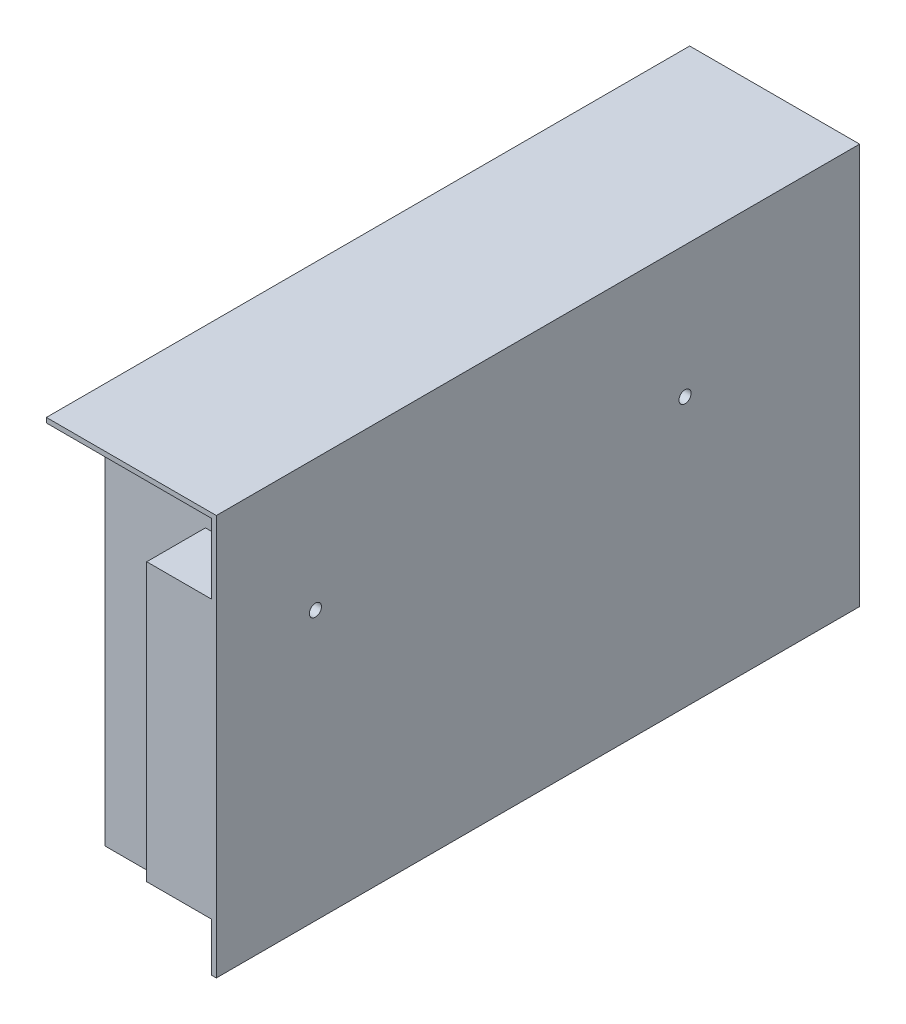
ISO-10303-21;
HEADER;
FILE_DESCRIPTION(('STEP AP214'),'2;1');
FILE_NAME('part.step','',(''),(''),'','','');
FILE_SCHEMA(('AUTOMOTIVE_DESIGN { 1 0 10303 214 1 1 1 1 }'));
ENDSEC;
DATA;
#1=APPLICATION_CONTEXT('core data for automotive mechanical design processes');
#2=APPLICATION_PROTOCOL_DEFINITION('international standard','automotive_design',2000,#1);
#3=PRODUCT_CONTEXT('',#1,'mechanical');
#4=PRODUCT('Part','Part','',(#3));
#5=PRODUCT_RELATED_PRODUCT_CATEGORY('part','',(#4));
#6=PRODUCT_DEFINITION_FORMATION('','',#4);
#7=PRODUCT_DEFINITION_CONTEXT('part definition',#1,'design');
#8=PRODUCT_DEFINITION('design','',#6,#7);
#9=PRODUCT_DEFINITION_SHAPE('','',#8);
#10=(LENGTH_UNIT() NAMED_UNIT(*) SI_UNIT(.MILLI.,.METRE.));
#11=(NAMED_UNIT(*) PLANE_ANGLE_UNIT() SI_UNIT($,.RADIAN.));
#12=(NAMED_UNIT(*) SI_UNIT($,.STERADIAN.) SOLID_ANGLE_UNIT());
#13=UNCERTAINTY_MEASURE_WITH_UNIT(LENGTH_MEASURE(1.E-05),#10,'distance_accuracy_value','');
#14=(GEOMETRIC_REPRESENTATION_CONTEXT(3) GLOBAL_UNCERTAINTY_ASSIGNED_CONTEXT((#13)) GLOBAL_UNIT_ASSIGNED_CONTEXT((#10,
#11,#12)) REPRESENTATION_CONTEXT('',''));
#15=CARTESIAN_POINT('',(0.,0.,0.));
#16=DIRECTION('',(0.,0.,1.));
#17=DIRECTION('',(1.,0.,0.));
#18=AXIS2_PLACEMENT_3D('',#15,#16,#17);
#19=CARTESIAN_POINT('',(40.8,0.,0.));
#20=DIRECTION('',(1.,0.,0.));
#21=DIRECTION('',(0.,0.,-1.));
#22=AXIS2_PLACEMENT_3D('',#19,#20,#21);
#23=PLANE('',#22);
#24=DIRECTION('',(0.,0.,1.));
#25=VECTOR('',#24,1.);
#26=CARTESIAN_POINT('',(40.8,-67.2045,42.3425));
#27=LINE('',#26,#25);
#28=CARTESIAN_POINT('',(40.8,-67.2045,42.3425));
#29=VERTEX_POINT('',#28);
#30=CARTESIAN_POINT('',(40.8,-67.2045,56.8425));
#31=VERTEX_POINT('',#30);
#32=EDGE_CURVE('E225',#29,#31,#27,.T.);
#33=ORIENTED_EDGE('',*,*,#32,.F.);
#34=DIRECTION('',(0.,-1.,0.));
#35=VECTOR('',#34,1.);
#36=CARTESIAN_POINT('',(40.8,18.5955,42.3425));
#37=LINE('',#36,#35);
#38=CARTESIAN_POINT('',(40.8,-79.2045,42.3425));
#39=VERTEX_POINT('',#38);
#40=EDGE_CURVE('E141',#29,#39,#37,.T.);
#41=ORIENTED_EDGE('',*,*,#40,.T.);
#42=DIRECTION('',(0.,0.,1.));
#43=VECTOR('',#42,1.);
#44=CARTESIAN_POINT('',(40.8,-79.2045,42.3425));
#45=LINE('',#44,#43);
#46=CARTESIAN_POINT('',(40.8,-79.2045,56.8425));
#47=VERTEX_POINT('',#46);
#48=EDGE_CURVE('E159',#39,#47,#45,.T.);
#49=ORIENTED_EDGE('',*,*,#48,.T.);
#50=DIRECTION('',(0.,1.,0.));
#51=VECTOR('',#50,1.);
#52=CARTESIAN_POINT('',(40.8,-79.2045,56.8425));
#53=LINE('',#52,#51);
#54=EDGE_CURVE('E154',#47,#31,#53,.T.);
#55=ORIENTED_EDGE('',*,*,#54,.T.);
#56=EDGE_LOOP('',(#33,#41,#49,#55));
#57=FACE_BOUND('',#56,.T.);
#58=ADVANCED_FACE('F35',(#57),#23,.F.);
#59=DIRECTION('',(0.,0.,-1.));
#60=VECTOR('',#59,1.);
#61=CARTESIAN_POINT('',(40.8,1.29549999999999,42.3425));
#62=LINE('',#61,#60);
#63=CARTESIAN_POINT('',(40.8,1.29549999999999,56.8425));
#64=VERTEX_POINT('',#63);
#65=CARTESIAN_POINT('',(40.8,1.29549999999999,42.3425));
#66=VERTEX_POINT('',#65);
#67=EDGE_CURVE('E136',#64,#66,#62,.T.);
#68=ORIENTED_EDGE('',*,*,#67,.F.);
#69=CARTESIAN_POINT('',(40.8,18.5955,56.8425));
#70=VERTEX_POINT('',#69);
#71=EDGE_CURVE('E158',#64,#70,#53,.T.);
#72=ORIENTED_EDGE('',*,*,#71,.T.);
#73=DIRECTION('',(0.,0.,-1.));
#74=VECTOR('',#73,1.);
#75=CARTESIAN_POINT('',(40.8,18.5955,56.8425));
#76=LINE('',#75,#74);
#77=CARTESIAN_POINT('',(40.8,18.5955,42.3425));
#78=VERTEX_POINT('',#77);
#79=EDGE_CURVE('E149',#70,#78,#76,.T.);
#80=ORIENTED_EDGE('',*,*,#79,.T.);
#81=EDGE_CURVE('E162',#78,#66,#37,.T.);
#82=ORIENTED_EDGE('',*,*,#81,.T.);
#83=EDGE_LOOP('',(#68,#72,#80,#82));
#84=FACE_BOUND('',#83,.T.);
#85=ADVANCED_FACE('F232',(#84),#23,.F.);
#86=CARTESIAN_POINT('',(140.869054814942,18.5955,42.3425));
#87=DIRECTION('',(0.,0.,-1.));
#88=DIRECTION('',(0.,1.,0.));
#89=AXIS2_PLACEMENT_3D('',#86,#87,#88);
#90=PLANE('',#89);
#91=DIRECTION('',(1.,0.,0.));
#92=VECTOR('',#91,1.);
#93=CARTESIAN_POINT('',(24.8,-67.2045,42.3425));
#94=LINE('',#93,#92);
#95=CARTESIAN_POINT('',(24.8,-67.2045,42.3425));
#96=VERTEX_POINT('',#95);
#97=EDGE_CURVE('E123',#96,#29,#94,.T.);
#98=ORIENTED_EDGE('',*,*,#97,.F.);
#99=DIRECTION('',(0.,-1.,0.));
#100=VECTOR('',#99,1.);
#101=CARTESIAN_POINT('',(24.8,1.29549999999999,42.3425));
#102=LINE('',#101,#100);
#103=CARTESIAN_POINT('',(24.8,1.29549999999999,42.3425));
#104=VERTEX_POINT('',#103);
#105=EDGE_CURVE('E130',#104,#96,#102,.T.);
#106=ORIENTED_EDGE('',*,*,#105,.F.);
#107=DIRECTION('',(1.,0.,0.));
#108=VECTOR('',#107,1.);
#109=CARTESIAN_POINT('',(24.8,1.29549999999999,42.3425));
#110=LINE('',#109,#108);
#111=EDGE_CURVE('E50',#104,#66,#110,.T.);
#112=ORIENTED_EDGE('',*,*,#111,.T.);
#113=ORIENTED_EDGE('',*,*,#81,.F.);
#114=DIRECTION('',(-1.,0.,0.));
#115=VECTOR('',#114,1.);
#116=CARTESIAN_POINT('',(140.869054814942,18.5955,42.3425));
#117=LINE('',#116,#115);
#118=CARTESIAN_POINT('',(0.,18.5955,42.3425));
#119=VERTEX_POINT('',#118);
#120=EDGE_CURVE('E153',#78,#119,#117,.T.);
#121=ORIENTED_EDGE('',*,*,#120,.T.);
#122=DIRECTION('',(0.,-1.,0.));
#123=VECTOR('',#122,1.);
#124=CARTESIAN_POINT('',(0.,18.5955,42.3425));
#125=LINE('',#124,#123);
#126=CARTESIAN_POINT('',(0.,-79.2045,42.3425));
#127=VERTEX_POINT('',#126);
#128=EDGE_CURVE('E143',#119,#127,#125,.T.);
#129=ORIENTED_EDGE('',*,*,#128,.T.);
#130=DIRECTION('',(-1.,0.,0.));
#131=VECTOR('',#130,1.);
#132=CARTESIAN_POINT('',(140.869054814942,-79.2045,42.3425));
#133=LINE('',#132,#131);
#134=EDGE_CURVE('E161',#39,#127,#133,.T.);
#135=ORIENTED_EDGE('',*,*,#134,.F.);
#136=ORIENTED_EDGE('',*,*,#40,.F.);
#137=EDGE_LOOP('',(#98,#106,#112,#113,#121,#129,#135,#136));
#138=FACE_BOUND('',#137,.T.);
#139=ADVANCED_FACE('F139',(#138),#90,.F.);
#140=CARTESIAN_POINT('',(42.,19.7955,56.8425));
#141=DIRECTION('',(0.,0.,-1.));
#142=DIRECTION('',(0.,1.,0.));
#143=AXIS2_PLACEMENT_3D('',#140,#141,#142);
#144=PLANE('',#143);
#145=DIRECTION('',(-1.,0.,0.));
#146=VECTOR('',#145,1.);
#147=CARTESIAN_POINT('',(140.869054814942,18.5955,56.8425));
#148=LINE('',#147,#146);
#149=CARTESIAN_POINT('',(0.,18.5955,56.8425));
#150=VERTEX_POINT('',#149);
#151=EDGE_CURVE('E157',#70,#150,#148,.T.);
#152=ORIENTED_EDGE('',*,*,#151,.F.);
#153=ORIENTED_EDGE('',*,*,#71,.F.);
#154=DIRECTION('',(1.,0.,0.));
#155=VECTOR('',#154,1.);
#156=CARTESIAN_POINT('',(24.8,1.29549999999999,56.8425));
#157=LINE('',#156,#155);
#158=CARTESIAN_POINT('',(24.8,1.29549999999999,56.8425));
#159=VERTEX_POINT('',#158);
#160=EDGE_CURVE('E145',#159,#64,#157,.T.);
#161=ORIENTED_EDGE('',*,*,#160,.F.);
#162=DIRECTION('',(0.,1.,0.));
#163=VECTOR('',#162,1.);
#164=CARTESIAN_POINT('',(24.8,1.29549999999999,56.8425));
#165=LINE('',#164,#163);
#166=CARTESIAN_POINT('',(24.8,-67.2045,56.8425));
#167=VERTEX_POINT('',#166);
#168=EDGE_CURVE('E129',#167,#159,#165,.T.);
#169=ORIENTED_EDGE('',*,*,#168,.F.);
#170=DIRECTION('',(1.,0.,0.));
#171=VECTOR('',#170,1.);
#172=CARTESIAN_POINT('',(24.8,-67.2045,56.8425));
#173=LINE('',#172,#171);
#174=EDGE_CURVE('E126',#167,#31,#173,.T.);
#175=ORIENTED_EDGE('',*,*,#174,.T.);
#176=ORIENTED_EDGE('',*,*,#54,.F.);
#177=DIRECTION('',(-1.,0.,0.));
#178=VECTOR('',#177,1.);
#179=CARTESIAN_POINT('',(42.,-79.2045,56.8425));
#180=LINE('',#179,#178);
#181=CARTESIAN_POINT('',(42.,-79.2045,56.8425));
#182=VERTEX_POINT('',#181);
#183=EDGE_CURVE('E12',#182,#47,#180,.T.);
#184=ORIENTED_EDGE('',*,*,#183,.F.);
#185=DIRECTION('',(0.,-1.,0.));
#186=VECTOR('',#185,1.);
#187=CARTESIAN_POINT('',(42.,19.7955,56.8425));
#188=LINE('',#187,#186);
#189=CARTESIAN_POINT('',(42.,19.7955,56.8425));
#190=VERTEX_POINT('',#189);
#191=EDGE_CURVE('E170',#190,#182,#188,.T.);
#192=ORIENTED_EDGE('',*,*,#191,.F.);
#193=DIRECTION('',(-1.,0.,0.));
#194=VECTOR('',#193,1.);
#195=CARTESIAN_POINT('',(42.,19.7955,56.8425));
#196=LINE('',#195,#194);
#197=CARTESIAN_POINT('',(0.,19.7955,56.8425));
#198=VERTEX_POINT('',#197);
#199=EDGE_CURVE('E180',#190,#198,#196,.T.);
#200=ORIENTED_EDGE('',*,*,#199,.T.);
#201=DIRECTION('',(0.,-1.,0.));
#202=VECTOR('',#201,1.);
#203=CARTESIAN_POINT('',(0.,19.7955,56.8425));
#204=LINE('',#203,#202);
#205=EDGE_CURVE('E169',#198,#150,#204,.T.);
#206=ORIENTED_EDGE('',*,*,#205,.T.);
#207=EDGE_LOOP('',(#152,#153,#161,#169,#175,#176,#184,#192,#200,#206));
#208=FACE_BOUND('',#207,.T.);
#209=ADVANCED_FACE('F37',(#208),#144,.F.);
#210=CARTESIAN_POINT('',(42.,-79.2045,56.8425));
#211=DIRECTION('',(0.,1.,0.));
#212=DIRECTION('',(0.,0.,1.));
#213=AXIS2_PLACEMENT_3D('',#210,#211,#212);
#214=PLANE('',#213);
#215=ORIENTED_EDGE('',*,*,#183,.T.);
#216=ORIENTED_EDGE('',*,*,#48,.F.);
#217=ORIENTED_EDGE('',*,*,#134,.T.);
#218=DIRECTION('',(0.,0.,-1.));
#219=VECTOR('',#218,1.);
#220=CARTESIAN_POINT('',(0.,-79.2045,56.8425));
#221=LINE('',#220,#219);
#222=CARTESIAN_POINT('',(0.,-79.2045,-102.1575));
#223=VERTEX_POINT('',#222);
#224=EDGE_CURVE('E183',#127,#223,#221,.T.);
#225=ORIENTED_EDGE('',*,*,#224,.T.);
#226=DIRECTION('',(-1.,0.,0.));
#227=VECTOR('',#226,1.);
#228=CARTESIAN_POINT('',(42.,-79.2045,-102.1575));
#229=LINE('',#228,#227);
#230=CARTESIAN_POINT('',(42.,-79.2045,-102.1575));
#231=VERTEX_POINT('',#230);
#232=EDGE_CURVE('E43',#231,#223,#229,.T.);
#233=ORIENTED_EDGE('',*,*,#232,.F.);
#234=DIRECTION('',(0.,0.,-1.));
#235=VECTOR('',#234,1.);
#236=CARTESIAN_POINT('',(42.,-79.2045,56.8425));
#237=LINE('',#236,#235);
#238=EDGE_CURVE('E173',#182,#231,#237,.T.);
#239=ORIENTED_EDGE('',*,*,#238,.F.);
#240=EDGE_LOOP('',(#215,#216,#217,#225,#233,#239));
#241=FACE_BOUND('',#240,.T.);
#242=ADVANCED_FACE('F217',(#241),#214,.F.);
#243=CARTESIAN_POINT('',(42.,19.7955,-102.1575));
#244=DIRECTION('',(0.,0.,1.));
#245=DIRECTION('',(0.,-1.,0.));
#246=AXIS2_PLACEMENT_3D('',#243,#244,#245);
#247=PLANE('',#246);
#248=DIRECTION('',(0.,1.,0.));
#249=VECTOR('',#248,1.);
#250=CARTESIAN_POINT('',(0.,19.7955,-102.1575));
#251=LINE('',#250,#249);
#252=CARTESIAN_POINT('',(0.,19.7955,-102.1575));
#253=VERTEX_POINT('',#252);
#254=EDGE_CURVE('E185',#223,#253,#251,.T.);
#255=ORIENTED_EDGE('',*,*,#254,.T.);
#256=DIRECTION('',(-1.,0.,0.));
#257=VECTOR('',#256,1.);
#258=CARTESIAN_POINT('',(42.,19.7955,-102.1575));
#259=LINE('',#258,#257);
#260=CARTESIAN_POINT('',(42.,19.7955,-102.1575));
#261=VERTEX_POINT('',#260);
#262=EDGE_CURVE('E190',#261,#253,#259,.T.);
#263=ORIENTED_EDGE('',*,*,#262,.F.);
#264=DIRECTION('',(0.,1.,0.));
#265=VECTOR('',#264,1.);
#266=CARTESIAN_POINT('',(42.,19.7955,-102.1575));
#267=LINE('',#266,#265);
#268=EDGE_CURVE('E176',#231,#261,#267,.T.);
#269=ORIENTED_EDGE('',*,*,#268,.F.);
#270=ORIENTED_EDGE('',*,*,#232,.T.);
#271=EDGE_LOOP('',(#255,#263,#269,#270));
#272=FACE_BOUND('',#271,.T.);
#273=ADVANCED_FACE('F197',(#272),#247,.F.);
#274=CARTESIAN_POINT('',(42.,19.7955,56.8425));
#275=DIRECTION('',(0.,-1.,0.));
#276=DIRECTION('',(0.,0.,-1.));
#277=AXIS2_PLACEMENT_3D('',#274,#275,#276);
#278=PLANE('',#277);
#279=DIRECTION('',(0.,0.,1.));
#280=VECTOR('',#279,1.);
#281=CARTESIAN_POINT('',(0.,19.7955,56.8425));
#282=LINE('',#281,#280);
#283=EDGE_CURVE('E174',#253,#198,#282,.T.);
#284=ORIENTED_EDGE('',*,*,#283,.T.);
#285=ORIENTED_EDGE('',*,*,#199,.F.);
#286=DIRECTION('',(0.,0.,1.));
#287=VECTOR('',#286,1.);
#288=CARTESIAN_POINT('',(42.,19.7955,56.8425));
#289=LINE('',#288,#287);
#290=EDGE_CURVE('E178',#261,#190,#289,.T.);
#291=ORIENTED_EDGE('',*,*,#290,.F.);
#292=ORIENTED_EDGE('',*,*,#262,.T.);
#293=EDGE_LOOP('',(#284,#285,#291,#292));
#294=FACE_BOUND('',#293,.T.);
#295=ADVANCED_FACE('F208',(#294),#278,.F.);
#296=CARTESIAN_POINT('',(42.,0.,0.));
#297=DIRECTION('',(1.,0.,0.));
#298=DIRECTION('',(0.,0.,-1.));
#299=AXIS2_PLACEMENT_3D('',#296,#297,#298);
#300=PLANE('',#299);
#301=CARTESIAN_POINT('',(42.,-12.7045,-59.0094801412472));
#302=DIRECTION('',(1.,0.,0.));
#303=DIRECTION('',(0.,0.,-1.));
#304=AXIS2_PLACEMENT_3D('',#301,#302,#303);
#305=CIRCLE('',#304,1.5);
#306=CARTESIAN_POINT('',(42.,-12.7045,-60.5094801412472));
#307=VERTEX_POINT('',#306);
#308=EDGE_CURVE('E291',#307,#307,#305,.T.);
#309=ORIENTED_EDGE('',*,*,#308,.F.);
#310=EDGE_LOOP('',(#309));
#311=FACE_BOUND('',#310,.T.);
#312=CARTESIAN_POINT('',(42.,-12.7045,32.3425));
#313=DIRECTION('',(1.,0.,0.));
#314=DIRECTION('',(0.,0.,-1.));
#315=AXIS2_PLACEMENT_3D('',#312,#313,#314);
#316=CIRCLE('',#315,1.5);
#317=CARTESIAN_POINT('',(42.,-12.7045,30.8425));
#318=VERTEX_POINT('',#317);
#319=EDGE_CURVE('E290',#318,#318,#316,.T.);
#320=ORIENTED_EDGE('',*,*,#319,.F.);
#321=EDGE_LOOP('',(#320));
#322=FACE_BOUND('',#321,.T.);
#323=ORIENTED_EDGE('',*,*,#191,.T.);
#324=ORIENTED_EDGE('',*,*,#238,.T.);
#325=ORIENTED_EDGE('',*,*,#268,.T.);
#326=ORIENTED_EDGE('',*,*,#290,.T.);
#327=EDGE_LOOP('',(#323,#324,#325,#326));
#328=FACE_BOUND('',#327,.T.);
#329=ADVANCED_FACE('F216',(#311,#322,#328),#300,.T.);
#330=CARTESIAN_POINT('',(0.,0.,0.));
#331=DIRECTION('',(1.,0.,0.));
#332=DIRECTION('',(0.,0.,-1.));
#333=AXIS2_PLACEMENT_3D('',#330,#331,#332);
#334=PLANE('',#333);
#335=ORIENTED_EDGE('',*,*,#128,.F.);
#336=DIRECTION('',(0.,0.,-1.));
#337=VECTOR('',#336,1.);
#338=CARTESIAN_POINT('',(0.,18.5955,56.8425));
#339=LINE('',#338,#337);
#340=EDGE_CURVE('E58',#150,#119,#339,.T.);
#341=ORIENTED_EDGE('',*,*,#340,.F.);
#342=ORIENTED_EDGE('',*,*,#205,.F.);
#343=ORIENTED_EDGE('',*,*,#283,.F.);
#344=ORIENTED_EDGE('',*,*,#254,.F.);
#345=ORIENTED_EDGE('',*,*,#224,.F.);
#346=EDGE_LOOP('',(#335,#341,#342,#343,#344,#345));
#347=FACE_BOUND('',#346,.T.);
#348=ADVANCED_FACE('F204',(#347),#334,.F.);
#349=CARTESIAN_POINT('',(140.869054814942,18.5955,56.8425));
#350=DIRECTION('',(0.,1.,0.));
#351=DIRECTION('',(0.,0.,1.));
#352=AXIS2_PLACEMENT_3D('',#349,#350,#351);
#353=PLANE('',#352);
#354=ORIENTED_EDGE('',*,*,#151,.T.);
#355=ORIENTED_EDGE('',*,*,#340,.T.);
#356=ORIENTED_EDGE('',*,*,#120,.F.);
#357=ORIENTED_EDGE('',*,*,#79,.F.);
#358=EDGE_LOOP('',(#354,#355,#356,#357));
#359=FACE_BOUND('',#358,.T.);
#360=ADVANCED_FACE('F234',(#359),#353,.F.);
#361=CARTESIAN_POINT('',(24.8,-67.2045,42.3425));
#362=DIRECTION('',(0.,1.,0.));
#363=DIRECTION('',(0.,0.,1.));
#364=AXIS2_PLACEMENT_3D('',#361,#362,#363);
#365=PLANE('',#364);
#366=ORIENTED_EDGE('',*,*,#32,.T.);
#367=ORIENTED_EDGE('',*,*,#174,.F.);
#368=DIRECTION('',(0.,0.,1.));
#369=VECTOR('',#368,1.);
#370=CARTESIAN_POINT('',(24.8,-67.2045,42.3425));
#371=LINE('',#370,#369);
#372=EDGE_CURVE('E119',#96,#167,#371,.T.);
#373=ORIENTED_EDGE('',*,*,#372,.F.);
#374=ORIENTED_EDGE('',*,*,#97,.T.);
#375=EDGE_LOOP('',(#366,#367,#373,#374));
#376=FACE_BOUND('',#375,.T.);
#377=ADVANCED_FACE('F121',(#376),#365,.F.);
#378=CARTESIAN_POINT('',(24.8,1.29549999999999,42.3425));
#379=DIRECTION('',(0.,-1.,0.));
#380=DIRECTION('',(0.,0.,-1.));
#381=AXIS2_PLACEMENT_3D('',#378,#379,#380);
#382=PLANE('',#381);
#383=ORIENTED_EDGE('',*,*,#67,.T.);
#384=ORIENTED_EDGE('',*,*,#111,.F.);
#385=DIRECTION('',(0.,0.,-1.));
#386=VECTOR('',#385,1.);
#387=CARTESIAN_POINT('',(24.8,1.29549999999999,42.3425));
#388=LINE('',#387,#386);
#389=EDGE_CURVE('E134',#159,#104,#388,.T.);
#390=ORIENTED_EDGE('',*,*,#389,.F.);
#391=ORIENTED_EDGE('',*,*,#160,.T.);
#392=EDGE_LOOP('',(#383,#384,#390,#391));
#393=FACE_BOUND('',#392,.T.);
#394=ADVANCED_FACE('F230',(#393),#382,.F.);
#395=CARTESIAN_POINT('',(24.8,0.,0.));
#396=DIRECTION('',(-1.,0.,0.));
#397=DIRECTION('',(0.,0.,1.));
#398=AXIS2_PLACEMENT_3D('',#395,#396,#397);
#399=PLANE('',#398);
#400=ORIENTED_EDGE('',*,*,#105,.T.);
#401=ORIENTED_EDGE('',*,*,#372,.T.);
#402=ORIENTED_EDGE('',*,*,#168,.T.);
#403=ORIENTED_EDGE('',*,*,#389,.T.);
#404=EDGE_LOOP('',(#400,#401,#402,#403));
#405=FACE_BOUND('',#404,.T.);
#406=ADVANCED_FACE('F133',(#405),#399,.T.);
#407=CARTESIAN_POINT('',(37.,-12.7045,32.3425));
#408=DIRECTION('',(1.,0.,0.));
#409=DIRECTION('',(0.,0.,-1.));
#410=AXIS2_PLACEMENT_3D('',#407,#408,#409);
#411=CYLINDRICAL_SURFACE('',#410,1.5);
#412=CARTESIAN_POINT('',(37.,-12.7045,32.3425));
#413=DIRECTION('',(1.,0.,0.));
#414=DIRECTION('',(0.,0.,-1.));
#415=AXIS2_PLACEMENT_3D('',#412,#413,#414);
#416=CIRCLE('',#415,1.5);
#417=CARTESIAN_POINT('',(37.,-12.7045,30.8425));
#418=VERTEX_POINT('',#417);
#419=EDGE_CURVE('E227',#418,#418,#416,.T.);
#420=ORIENTED_EDGE('',*,*,#419,.F.);
#421=EDGE_LOOP('',(#420));
#422=FACE_BOUND('',#421,.T.);
#423=ORIENTED_EDGE('',*,*,#319,.T.);
#424=EDGE_LOOP('',(#423));
#425=FACE_BOUND('',#424,.T.);
#426=ADVANCED_FACE('F270',(#422,#425),#411,.F.);
#427=CARTESIAN_POINT('',(37.,-12.7045,32.3425));
#428=DIRECTION('',(1.,0.,0.));
#429=DIRECTION('',(0.,0.,-1.));
#430=AXIS2_PLACEMENT_3D('',#427,#428,#429);
#431=PLANE('',#430);
#432=ORIENTED_EDGE('',*,*,#419,.T.);
#433=EDGE_LOOP('',(#432));
#434=FACE_BOUND('',#433,.T.);
#435=ADVANCED_FACE('F273',(#434),#431,.T.);
#436=CARTESIAN_POINT('',(37.,-12.7045,-59.0094801412472));
#437=DIRECTION('',(1.,0.,0.));
#438=DIRECTION('',(0.,0.,-1.));
#439=AXIS2_PLACEMENT_3D('',#436,#437,#438);
#440=CYLINDRICAL_SURFACE('',#439,1.5);
#441=CARTESIAN_POINT('',(37.,-12.7045,-59.0094801412472));
#442=DIRECTION('',(1.,0.,0.));
#443=DIRECTION('',(0.,0.,-1.));
#444=AXIS2_PLACEMENT_3D('',#441,#442,#443);
#445=CIRCLE('',#444,1.5);
#446=CARTESIAN_POINT('',(37.,-12.7045,-60.5094801412472));
#447=VERTEX_POINT('',#446);
#448=EDGE_CURVE('E289',#447,#447,#445,.T.);
#449=ORIENTED_EDGE('',*,*,#448,.F.);
#450=EDGE_LOOP('',(#449));
#451=FACE_BOUND('',#450,.T.);
#452=ORIENTED_EDGE('',*,*,#308,.T.);
#453=EDGE_LOOP('',(#452));
#454=FACE_BOUND('',#453,.T.);
#455=ADVANCED_FACE('F277',(#451,#454),#440,.F.);
#456=CARTESIAN_POINT('',(37.,-12.7045,-59.0094801412472));
#457=DIRECTION('',(1.,0.,0.));
#458=DIRECTION('',(0.,0.,-1.));
#459=AXIS2_PLACEMENT_3D('',#456,#457,#458);
#460=PLANE('',#459);
#461=ORIENTED_EDGE('',*,*,#448,.T.);
#462=EDGE_LOOP('',(#461));
#463=FACE_BOUND('',#462,.T.);
#464=ADVANCED_FACE('F281',(#463),#460,.T.);
#465=CLOSED_SHELL('',(#58,#85,#139,#209,#242,#273,#295,#329,#348,#360,#377,#394,#406,#426,#435,
#455,#464));
#466=MANIFOLD_SOLID_BREP('B2',#465);
#467=ADVANCED_BREP_SHAPE_REPRESENTATION('',(#18,#466),#14);
#468=SHAPE_DEFINITION_REPRESENTATION(#9,#467);
ENDSEC;
END-ISO-10303-21;
